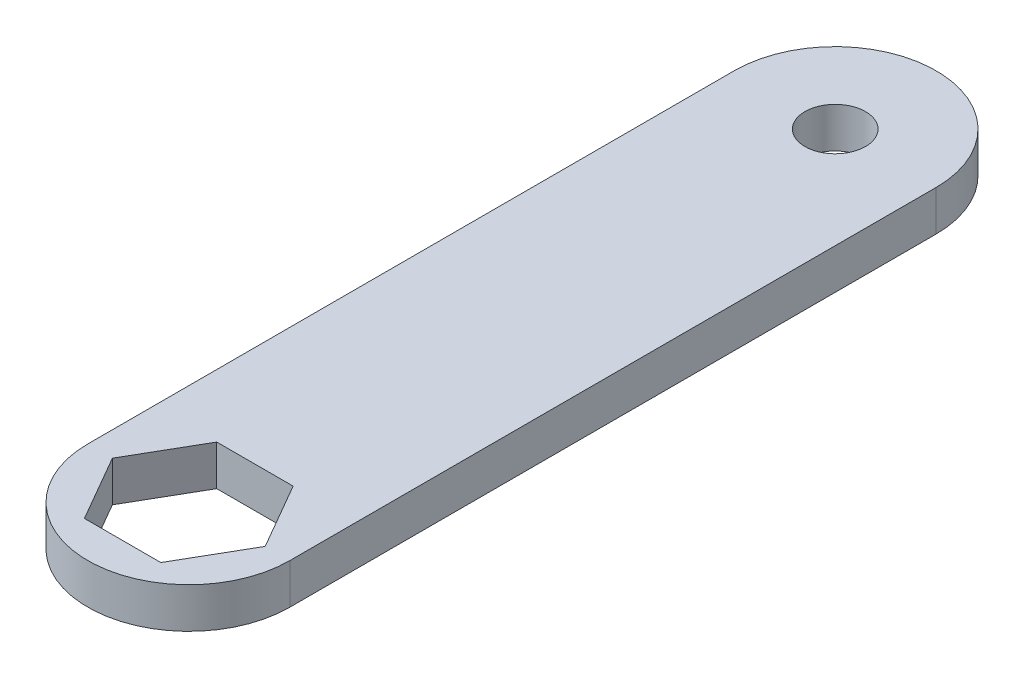
ISO-10303-21;
HEADER;
FILE_DESCRIPTION(('STEP AP214'),'2;1');
FILE_NAME('part.step','',(''),(''),'','','');
FILE_SCHEMA(('AUTOMOTIVE_DESIGN { 1 0 10303 214 1 1 1 1 }'));
ENDSEC;
DATA;
#1=APPLICATION_CONTEXT('core data for automotive mechanical design processes');
#2=APPLICATION_PROTOCOL_DEFINITION('international standard','automotive_design',2000,#1);
#3=PRODUCT_CONTEXT('',#1,'mechanical');
#4=PRODUCT('Part','Part','',(#3));
#5=PRODUCT_RELATED_PRODUCT_CATEGORY('part','',(#4));
#6=PRODUCT_DEFINITION_FORMATION('','',#4);
#7=PRODUCT_DEFINITION_CONTEXT('part definition',#1,'design');
#8=PRODUCT_DEFINITION('design','',#6,#7);
#9=PRODUCT_DEFINITION_SHAPE('','',#8);
#10=(LENGTH_UNIT() NAMED_UNIT(*) SI_UNIT(.MILLI.,.METRE.));
#11=(NAMED_UNIT(*) PLANE_ANGLE_UNIT() SI_UNIT($,.RADIAN.));
#12=(NAMED_UNIT(*) SI_UNIT($,.STERADIAN.) SOLID_ANGLE_UNIT());
#13=UNCERTAINTY_MEASURE_WITH_UNIT(LENGTH_MEASURE(1.E-05),#10,'distance_accuracy_value','');
#14=(GEOMETRIC_REPRESENTATION_CONTEXT(3) GLOBAL_UNCERTAINTY_ASSIGNED_CONTEXT((#13)) GLOBAL_UNIT_ASSIGNED_CONTEXT((#10,
#11,#12)) REPRESENTATION_CONTEXT('',''));
#15=CARTESIAN_POINT('',(0.,0.,0.));
#16=DIRECTION('',(0.,0.,1.));
#17=DIRECTION('',(1.,0.,0.));
#18=AXIS2_PLACEMENT_3D('',#15,#16,#17);
#19=CARTESIAN_POINT('',(0.,2.,16.));
#20=DIRECTION('',(0.,1.,0.));
#21=DIRECTION('',(0.,0.,1.));
#22=AXIS2_PLACEMENT_3D('',#19,#20,#21);
#23=PLANE('',#22);
#24=CARTESIAN_POINT('',(0.,2.,16.));
#25=DIRECTION('',(0.,1.,0.));
#26=DIRECTION('',(0.,0.,1.));
#27=AXIS2_PLACEMENT_3D('',#24,#25,#26);
#28=CIRCLE('',#27,4.99999999999999);
#29=CARTESIAN_POINT('',(-4.99999999999999,2.,16.));
#30=VERTEX_POINT('',#29);
#31=CARTESIAN_POINT('',(4.99999999999999,2.,16.));
#32=VERTEX_POINT('',#31);
#33=EDGE_CURVE('E194',#30,#32,#28,.T.);
#34=ORIENTED_EDGE('',*,*,#33,.T.);
#35=DIRECTION('',(0.,0.,-1.));
#36=VECTOR('',#35,1.);
#37=CARTESIAN_POINT('',(4.99999999999999,2.,16.));
#38=LINE('',#37,#36);
#39=CARTESIAN_POINT('',(4.99999999999999,2.,-16.));
#40=VERTEX_POINT('',#39);
#41=EDGE_CURVE('E198',#32,#40,#38,.T.);
#42=ORIENTED_EDGE('',*,*,#41,.T.);
#43=CARTESIAN_POINT('',(0.,2.,-16.));
#44=DIRECTION('',(0.,1.,0.));
#45=DIRECTION('',(0.,0.,1.));
#46=AXIS2_PLACEMENT_3D('',#43,#44,#45);
#47=CIRCLE('',#46,4.99999999999999);
#48=CARTESIAN_POINT('',(-5.,2.,-16.));
#49=VERTEX_POINT('',#48);
#50=EDGE_CURVE('E202',#40,#49,#47,.T.);
#51=ORIENTED_EDGE('',*,*,#50,.T.);
#52=DIRECTION('',(0.,0.,1.));
#53=VECTOR('',#52,1.);
#54=CARTESIAN_POINT('',(-4.99999999999999,2.,16.));
#55=LINE('',#54,#53);
#56=EDGE_CURVE('E205',#49,#30,#55,.T.);
#57=ORIENTED_EDGE('',*,*,#56,.T.);
#58=EDGE_LOOP('',(#34,#42,#51,#57));
#59=FACE_BOUND('',#58,.T.);
#60=CARTESIAN_POINT('',(0.,2.,-16.));
#61=DIRECTION('',(0.,1.,0.));
#62=DIRECTION('',(0.,0.,1.));
#63=AXIS2_PLACEMENT_3D('',#60,#61,#62);
#64=CIRCLE('',#63,1.5);
#65=CARTESIAN_POINT('',(0.,2.,-14.5));
#66=VERTEX_POINT('',#65);
#67=EDGE_CURVE('E186',#66,#66,#64,.T.);
#68=ORIENTED_EDGE('',*,*,#67,.F.);
#69=EDGE_LOOP('',(#68));
#70=FACE_BOUND('',#69,.T.);
#71=DIRECTION('',(-1.,0.,0.));
#72=VECTOR('',#71,1.);
#73=CARTESIAN_POINT('',(1.89082213159603,2.,12.725));
#74=LINE('',#73,#72);
#75=CARTESIAN_POINT('',(1.89082213159603,2.,12.725));
#76=VERTEX_POINT('',#75);
#77=CARTESIAN_POINT('',(-1.89082213159602,2.,12.725));
#78=VERTEX_POINT('',#77);
#79=EDGE_CURVE('E126',#76,#78,#74,.T.);
#80=ORIENTED_EDGE('',*,*,#79,.F.);
#81=DIRECTION('',(-0.5,0.,-0.866025403784439));
#82=VECTOR('',#81,1.);
#83=CARTESIAN_POINT('',(3.78164426319206,2.,16.));
#84=LINE('',#83,#82);
#85=CARTESIAN_POINT('',(3.78164426319206,2.,16.));
#86=VERTEX_POINT('',#85);
#87=EDGE_CURVE('E117',#86,#76,#84,.T.);
#88=ORIENTED_EDGE('',*,*,#87,.F.);
#89=DIRECTION('',(0.5,0.,-0.866025403784439));
#90=VECTOR('',#89,1.);
#91=CARTESIAN_POINT('',(1.89082213159603,2.,19.275));
#92=LINE('',#91,#90);
#93=CARTESIAN_POINT('',(1.89082213159603,2.,19.275));
#94=VERTEX_POINT('',#93);
#95=EDGE_CURVE('E152',#94,#86,#92,.T.);
#96=ORIENTED_EDGE('',*,*,#95,.F.);
#97=DIRECTION('',(1.,0.,0.));
#98=VECTOR('',#97,1.);
#99=CARTESIAN_POINT('',(-1.89082213159602,2.,19.275));
#100=LINE('',#99,#98);
#101=CARTESIAN_POINT('',(-1.89082213159602,2.,19.275));
#102=VERTEX_POINT('',#101);
#103=EDGE_CURVE('E149',#102,#94,#100,.T.);
#104=ORIENTED_EDGE('',*,*,#103,.F.);
#105=DIRECTION('',(0.5,0.,0.866025403784438));
#106=VECTOR('',#105,1.);
#107=CARTESIAN_POINT('',(-3.78164426319204,2.,16.));
#108=LINE('',#107,#106);
#109=CARTESIAN_POINT('',(-3.78164426319204,2.,16.));
#110=VERTEX_POINT('',#109);
#111=EDGE_CURVE('E144',#110,#102,#108,.T.);
#112=ORIENTED_EDGE('',*,*,#111,.F.);
#113=DIRECTION('',(-0.5,0.,0.866025403784439));
#114=VECTOR('',#113,1.);
#115=CARTESIAN_POINT('',(-1.89082213159602,2.,12.725));
#116=LINE('',#115,#114);
#117=EDGE_CURVE('E140',#78,#110,#116,.T.);
#118=ORIENTED_EDGE('',*,*,#117,.F.);
#119=EDGE_LOOP('',(#80,#88,#96,#104,#112,#118));
#120=FACE_BOUND('',#119,.T.);
#121=ADVANCED_FACE('F39',(#59,#70,#120),#23,.T.);
#122=CARTESIAN_POINT('',(0.,0.,16.));
#123=DIRECTION('',(0.,1.,0.));
#124=DIRECTION('',(0.,0.,1.));
#125=AXIS2_PLACEMENT_3D('',#122,#123,#124);
#126=PLANE('',#125);
#127=CARTESIAN_POINT('',(0.,0.,-16.));
#128=DIRECTION('',(0.,1.,0.));
#129=DIRECTION('',(0.,0.,1.));
#130=AXIS2_PLACEMENT_3D('',#127,#128,#129);
#131=CIRCLE('',#130,1.5);
#132=CARTESIAN_POINT('',(0.,0.,-14.5));
#133=VERTEX_POINT('',#132);
#134=EDGE_CURVE('E135',#133,#133,#131,.T.);
#135=ORIENTED_EDGE('',*,*,#134,.T.);
#136=EDGE_LOOP('',(#135));
#137=FACE_BOUND('',#136,.T.);
#138=CARTESIAN_POINT('',(0.,0.,16.));
#139=DIRECTION('',(0.,1.,0.));
#140=DIRECTION('',(0.,0.,1.));
#141=AXIS2_PLACEMENT_3D('',#138,#139,#140);
#142=CIRCLE('',#141,4.99999999999999);
#143=CARTESIAN_POINT('',(-4.99999999999999,0.,16.));
#144=VERTEX_POINT('',#143);
#145=CARTESIAN_POINT('',(4.99999999999999,0.,16.));
#146=VERTEX_POINT('',#145);
#147=EDGE_CURVE('E190',#144,#146,#142,.T.);
#148=ORIENTED_EDGE('',*,*,#147,.F.);
#149=DIRECTION('',(0.,0.,1.));
#150=VECTOR('',#149,1.);
#151=CARTESIAN_POINT('',(-4.99999999999999,0.,16.));
#152=LINE('',#151,#150);
#153=CARTESIAN_POINT('',(-5.,0.,-16.));
#154=VERTEX_POINT('',#153);
#155=EDGE_CURVE('E199',#154,#144,#152,.T.);
#156=ORIENTED_EDGE('',*,*,#155,.F.);
#157=CARTESIAN_POINT('',(0.,0.,-16.));
#158=DIRECTION('',(0.,1.,0.));
#159=DIRECTION('',(0.,0.,1.));
#160=AXIS2_PLACEMENT_3D('',#157,#158,#159);
#161=CIRCLE('',#160,4.99999999999999);
#162=CARTESIAN_POINT('',(4.99999999999999,0.,-16.));
#163=VERTEX_POINT('',#162);
#164=EDGE_CURVE('E215',#163,#154,#161,.T.);
#165=ORIENTED_EDGE('',*,*,#164,.F.);
#166=DIRECTION('',(0.,0.,-1.));
#167=VECTOR('',#166,1.);
#168=CARTESIAN_POINT('',(4.99999999999999,0.,16.));
#169=LINE('',#168,#167);
#170=EDGE_CURVE('E212',#146,#163,#169,.T.);
#171=ORIENTED_EDGE('',*,*,#170,.F.);
#172=EDGE_LOOP('',(#148,#156,#165,#171));
#173=FACE_BOUND('',#172,.T.);
#174=DIRECTION('',(-0.5,0.,-0.866025403784439));
#175=VECTOR('',#174,1.);
#176=CARTESIAN_POINT('',(3.78164426319206,0.,16.));
#177=LINE('',#176,#175);
#178=CARTESIAN_POINT('',(3.78164426319206,0.,16.));
#179=VERTEX_POINT('',#178);
#180=CARTESIAN_POINT('',(1.89082213159603,0.,12.725));
#181=VERTEX_POINT('',#180);
#182=EDGE_CURVE('E63',#179,#181,#177,.T.);
#183=ORIENTED_EDGE('',*,*,#182,.T.);
#184=DIRECTION('',(-1.,0.,0.));
#185=VECTOR('',#184,1.);
#186=CARTESIAN_POINT('',(1.89082213159603,0.,12.725));
#187=LINE('',#186,#185);
#188=CARTESIAN_POINT('',(-1.89082213159602,0.,12.725));
#189=VERTEX_POINT('',#188);
#190=EDGE_CURVE('E133',#181,#189,#187,.T.);
#191=ORIENTED_EDGE('',*,*,#190,.T.);
#192=DIRECTION('',(-0.5,0.,0.866025403784439));
#193=VECTOR('',#192,1.);
#194=CARTESIAN_POINT('',(-1.89082213159602,0.,12.725));
#195=LINE('',#194,#193);
#196=CARTESIAN_POINT('',(-3.78164426319204,0.,16.));
#197=VERTEX_POINT('',#196);
#198=EDGE_CURVE('E159',#189,#197,#195,.T.);
#199=ORIENTED_EDGE('',*,*,#198,.T.);
#200=DIRECTION('',(0.5,0.,0.866025403784438));
#201=VECTOR('',#200,1.);
#202=CARTESIAN_POINT('',(-3.78164426319204,0.,16.));
#203=LINE('',#202,#201);
#204=CARTESIAN_POINT('',(-1.89082213159602,0.,19.275));
#205=VERTEX_POINT('',#204);
#206=EDGE_CURVE('E163',#197,#205,#203,.T.);
#207=ORIENTED_EDGE('',*,*,#206,.T.);
#208=DIRECTION('',(1.,0.,0.));
#209=VECTOR('',#208,1.);
#210=CARTESIAN_POINT('',(-1.89082213159602,0.,19.275));
#211=LINE('',#210,#209);
#212=CARTESIAN_POINT('',(1.89082213159603,0.,19.275));
#213=VERTEX_POINT('',#212);
#214=EDGE_CURVE('E167',#205,#213,#211,.T.);
#215=ORIENTED_EDGE('',*,*,#214,.T.);
#216=DIRECTION('',(0.5,0.,-0.866025403784439));
#217=VECTOR('',#216,1.);
#218=CARTESIAN_POINT('',(1.89082213159603,0.,19.275));
#219=LINE('',#218,#217);
#220=EDGE_CURVE('E127',#213,#179,#219,.T.);
#221=ORIENTED_EDGE('',*,*,#220,.T.);
#222=EDGE_LOOP('',(#183,#191,#199,#207,#215,#221));
#223=FACE_BOUND('',#222,.T.);
#224=ADVANCED_FACE('F238',(#137,#173,#223),#126,.F.);
#225=CARTESIAN_POINT('',(0.,2.,16.));
#226=DIRECTION('',(0.,-1.,0.));
#227=DIRECTION('',(0.,0.,-1.));
#228=AXIS2_PLACEMENT_3D('',#225,#226,#227);
#229=CYLINDRICAL_SURFACE('',#228,4.99999999999999);
#230=ORIENTED_EDGE('',*,*,#147,.T.);
#231=DIRECTION('',(0.,-1.,0.));
#232=VECTOR('',#231,1.);
#233=CARTESIAN_POINT('',(4.99999999999999,2.,16.));
#234=LINE('',#233,#232);
#235=EDGE_CURVE('E11',#32,#146,#234,.T.);
#236=ORIENTED_EDGE('',*,*,#235,.F.);
#237=ORIENTED_EDGE('',*,*,#33,.F.);
#238=DIRECTION('',(0.,-1.,0.));
#239=VECTOR('',#238,1.);
#240=CARTESIAN_POINT('',(-4.99999999999999,2.,16.));
#241=LINE('',#240,#239);
#242=EDGE_CURVE('E208',#30,#144,#241,.T.);
#243=ORIENTED_EDGE('',*,*,#242,.T.);
#244=EDGE_LOOP('',(#230,#236,#237,#243));
#245=FACE_BOUND('',#244,.T.);
#246=ADVANCED_FACE('F41',(#245),#229,.T.);
#247=CARTESIAN_POINT('',(4.99999999999999,2.,16.));
#248=DIRECTION('',(-1.,0.,0.));
#249=DIRECTION('',(0.,0.,1.));
#250=AXIS2_PLACEMENT_3D('',#247,#248,#249);
#251=PLANE('',#250);
#252=ORIENTED_EDGE('',*,*,#170,.T.);
#253=DIRECTION('',(0.,-1.,0.));
#254=VECTOR('',#253,1.);
#255=CARTESIAN_POINT('',(4.99999999999999,2.,-16.));
#256=LINE('',#255,#254);
#257=EDGE_CURVE('E48',#40,#163,#256,.T.);
#258=ORIENTED_EDGE('',*,*,#257,.F.);
#259=ORIENTED_EDGE('',*,*,#41,.F.);
#260=ORIENTED_EDGE('',*,*,#235,.T.);
#261=EDGE_LOOP('',(#252,#258,#259,#260));
#262=FACE_BOUND('',#261,.T.);
#263=ADVANCED_FACE('F249',(#262),#251,.F.);
#264=CARTESIAN_POINT('',(0.,2.,-16.));
#265=DIRECTION('',(0.,-1.,0.));
#266=DIRECTION('',(0.,0.,-1.));
#267=AXIS2_PLACEMENT_3D('',#264,#265,#266);
#268=CYLINDRICAL_SURFACE('',#267,4.99999999999999);
#269=ORIENTED_EDGE('',*,*,#164,.T.);
#270=DIRECTION('',(0.,-1.,0.));
#271=VECTOR('',#270,1.);
#272=CARTESIAN_POINT('',(-5.,2.,-16.));
#273=LINE('',#272,#271);
#274=EDGE_CURVE('E223',#49,#154,#273,.T.);
#275=ORIENTED_EDGE('',*,*,#274,.F.);
#276=ORIENTED_EDGE('',*,*,#50,.F.);
#277=ORIENTED_EDGE('',*,*,#257,.T.);
#278=EDGE_LOOP('',(#269,#275,#276,#277));
#279=FACE_BOUND('',#278,.T.);
#280=ADVANCED_FACE('F232',(#279),#268,.T.);
#281=CARTESIAN_POINT('',(-4.99999999999999,2.,16.));
#282=DIRECTION('',(1.,0.,0.));
#283=DIRECTION('',(0.,0.,-1.));
#284=AXIS2_PLACEMENT_3D('',#281,#282,#283);
#285=PLANE('',#284);
#286=ORIENTED_EDGE('',*,*,#155,.T.);
#287=ORIENTED_EDGE('',*,*,#242,.F.);
#288=ORIENTED_EDGE('',*,*,#56,.F.);
#289=ORIENTED_EDGE('',*,*,#274,.T.);
#290=EDGE_LOOP('',(#286,#287,#288,#289));
#291=FACE_BOUND('',#290,.T.);
#292=ADVANCED_FACE('F242',(#291),#285,.F.);
#293=CARTESIAN_POINT('',(0.,2.,-16.));
#294=DIRECTION('',(0.,-1.,0.));
#295=DIRECTION('',(0.,0.,-1.));
#296=AXIS2_PLACEMENT_3D('',#293,#294,#295);
#297=CYLINDRICAL_SURFACE('',#296,1.5);
#298=ORIENTED_EDGE('',*,*,#67,.T.);
#299=EDGE_LOOP('',(#298));
#300=FACE_BOUND('',#299,.T.);
#301=ORIENTED_EDGE('',*,*,#134,.F.);
#302=EDGE_LOOP('',(#301));
#303=FACE_BOUND('',#302,.T.);
#304=ADVANCED_FACE('F264',(#300,#303),#297,.F.);
#305=CARTESIAN_POINT('',(3.78164426319206,2.,16.));
#306=DIRECTION('',(-0.866025403784439,0.,0.5));
#307=DIRECTION('',(0.5,0.,0.866025403784439));
#308=AXIS2_PLACEMENT_3D('',#305,#306,#307);
#309=PLANE('',#308);
#310=ORIENTED_EDGE('',*,*,#182,.F.);
#311=DIRECTION('',(0.,-1.,0.));
#312=VECTOR('',#311,1.);
#313=CARTESIAN_POINT('',(3.78164426319206,2.,16.));
#314=LINE('',#313,#312);
#315=EDGE_CURVE('E121',#86,#179,#314,.T.);
#316=ORIENTED_EDGE('',*,*,#315,.F.);
#317=ORIENTED_EDGE('',*,*,#87,.T.);
#318=DIRECTION('',(0.,-1.,0.));
#319=VECTOR('',#318,1.);
#320=CARTESIAN_POINT('',(1.89082213159603,2.,12.725));
#321=LINE('',#320,#319);
#322=EDGE_CURVE('E120',#76,#181,#321,.T.);
#323=ORIENTED_EDGE('',*,*,#322,.T.);
#324=EDGE_LOOP('',(#310,#316,#317,#323));
#325=FACE_BOUND('',#324,.T.);
#326=ADVANCED_FACE('F119',(#325),#309,.T.);
#327=CARTESIAN_POINT('',(1.89082213159603,2.,12.725));
#328=DIRECTION('',(0.,0.,1.));
#329=DIRECTION('',(1.,0.,0.));
#330=AXIS2_PLACEMENT_3D('',#327,#328,#329);
#331=PLANE('',#330);
#332=ORIENTED_EDGE('',*,*,#190,.F.);
#333=ORIENTED_EDGE('',*,*,#322,.F.);
#334=ORIENTED_EDGE('',*,*,#79,.T.);
#335=DIRECTION('',(0.,-1.,0.));
#336=VECTOR('',#335,1.);
#337=CARTESIAN_POINT('',(-1.89082213159602,2.,12.725));
#338=LINE('',#337,#336);
#339=EDGE_CURVE('E136',#78,#189,#338,.T.);
#340=ORIENTED_EDGE('',*,*,#339,.T.);
#341=EDGE_LOOP('',(#332,#333,#334,#340));
#342=FACE_BOUND('',#341,.T.);
#343=ADVANCED_FACE('F130',(#342),#331,.T.);
#344=CARTESIAN_POINT('',(-1.89082213159602,2.,12.725));
#345=DIRECTION('',(0.866025403784439,0.,0.5));
#346=DIRECTION('',(0.5,0.,-0.866025403784439));
#347=AXIS2_PLACEMENT_3D('',#344,#345,#346);
#348=PLANE('',#347);
#349=ORIENTED_EDGE('',*,*,#198,.F.);
#350=ORIENTED_EDGE('',*,*,#339,.F.);
#351=ORIENTED_EDGE('',*,*,#117,.T.);
#352=DIRECTION('',(0.,-1.,0.));
#353=VECTOR('',#352,1.);
#354=CARTESIAN_POINT('',(-3.78164426319204,2.,16.));
#355=LINE('',#354,#353);
#356=EDGE_CURVE('E181',#110,#197,#355,.T.);
#357=ORIENTED_EDGE('',*,*,#356,.T.);
#358=EDGE_LOOP('',(#349,#350,#351,#357));
#359=FACE_BOUND('',#358,.T.);
#360=ADVANCED_FACE('F281',(#359),#348,.T.);
#361=CARTESIAN_POINT('',(-3.78164426319204,2.,16.));
#362=DIRECTION('',(0.866025403784439,0.,-0.5));
#363=DIRECTION('',(-0.5,0.,-0.866025403784438));
#364=AXIS2_PLACEMENT_3D('',#361,#362,#363);
#365=PLANE('',#364);
#366=ORIENTED_EDGE('',*,*,#206,.F.);
#367=ORIENTED_EDGE('',*,*,#356,.F.);
#368=ORIENTED_EDGE('',*,*,#111,.T.);
#369=DIRECTION('',(0.,-1.,0.));
#370=VECTOR('',#369,1.);
#371=CARTESIAN_POINT('',(-1.89082213159602,2.,19.275));
#372=LINE('',#371,#370);
#373=EDGE_CURVE('E178',#102,#205,#372,.T.);
#374=ORIENTED_EDGE('',*,*,#373,.T.);
#375=EDGE_LOOP('',(#366,#367,#368,#374));
#376=FACE_BOUND('',#375,.T.);
#377=ADVANCED_FACE('F286',(#376),#365,.T.);
#378=CARTESIAN_POINT('',(-1.89082213159602,2.,19.275));
#379=DIRECTION('',(0.,0.,-1.));
#380=DIRECTION('',(-1.,0.,0.));
#381=AXIS2_PLACEMENT_3D('',#378,#379,#380);
#382=PLANE('',#381);
#383=ORIENTED_EDGE('',*,*,#214,.F.);
#384=ORIENTED_EDGE('',*,*,#373,.F.);
#385=ORIENTED_EDGE('',*,*,#103,.T.);
#386=DIRECTION('',(0.,-1.,0.));
#387=VECTOR('',#386,1.);
#388=CARTESIAN_POINT('',(1.89082213159603,2.,19.275));
#389=LINE('',#388,#387);
#390=EDGE_CURVE('E55',#94,#213,#389,.T.);
#391=ORIENTED_EDGE('',*,*,#390,.T.);
#392=EDGE_LOOP('',(#383,#384,#385,#391));
#393=FACE_BOUND('',#392,.T.);
#394=ADVANCED_FACE('F290',(#393),#382,.T.);
#395=CARTESIAN_POINT('',(1.89082213159603,2.,19.275));
#396=DIRECTION('',(-0.866025403784439,0.,-0.5));
#397=DIRECTION('',(-0.5,0.,0.866025403784439));
#398=AXIS2_PLACEMENT_3D('',#395,#396,#397);
#399=PLANE('',#398);
#400=ORIENTED_EDGE('',*,*,#220,.F.);
#401=ORIENTED_EDGE('',*,*,#390,.F.);
#402=ORIENTED_EDGE('',*,*,#95,.T.);
#403=ORIENTED_EDGE('',*,*,#315,.T.);
#404=EDGE_LOOP('',(#400,#401,#402,#403));
#405=FACE_BOUND('',#404,.T.);
#406=ADVANCED_FACE('F294',(#405),#399,.T.);
#407=CLOSED_SHELL('',(#121,#224,#246,#263,#280,#292,#304,#326,#343,#360,#377,#394,#406));
#408=MANIFOLD_SOLID_BREP('B2',#407);
#409=ADVANCED_BREP_SHAPE_REPRESENTATION('',(#18,#408),#14);
#410=SHAPE_DEFINITION_REPRESENTATION(#9,#409);
ENDSEC;
END-ISO-10303-21;
